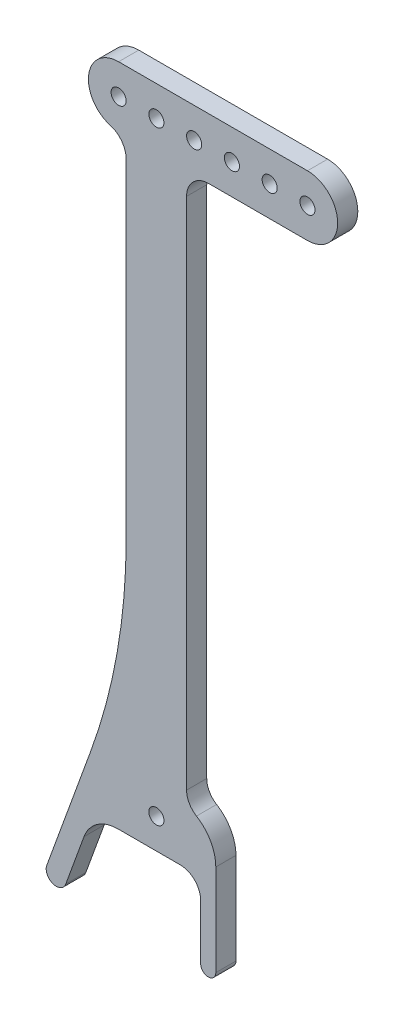
ISO-10303-21;
HEADER;
FILE_DESCRIPTION(('STEP AP214'),'2;1');
FILE_NAME('part.step','',(''),(''),'','','');
FILE_SCHEMA(('AUTOMOTIVE_DESIGN { 1 0 10303 214 1 1 1 1 }'));
ENDSEC;
DATA;
#1=APPLICATION_CONTEXT('core data for automotive mechanical design processes');
#2=APPLICATION_PROTOCOL_DEFINITION('international standard','automotive_design',2000,#1);
#3=PRODUCT_CONTEXT('',#1,'mechanical');
#4=PRODUCT('Part','Part','',(#3));
#5=PRODUCT_RELATED_PRODUCT_CATEGORY('part','',(#4));
#6=PRODUCT_DEFINITION_FORMATION('','',#4);
#7=PRODUCT_DEFINITION_CONTEXT('part definition',#1,'design');
#8=PRODUCT_DEFINITION('design','',#6,#7);
#9=PRODUCT_DEFINITION_SHAPE('','',#8);
#10=(LENGTH_UNIT() NAMED_UNIT(*) SI_UNIT(.MILLI.,.METRE.));
#11=(NAMED_UNIT(*) PLANE_ANGLE_UNIT() SI_UNIT($,.RADIAN.));
#12=(NAMED_UNIT(*) SI_UNIT($,.STERADIAN.) SOLID_ANGLE_UNIT());
#13=UNCERTAINTY_MEASURE_WITH_UNIT(LENGTH_MEASURE(1.E-05),#10,'distance_accuracy_value','');
#14=(GEOMETRIC_REPRESENTATION_CONTEXT(3) GLOBAL_UNCERTAINTY_ASSIGNED_CONTEXT((#13)) GLOBAL_UNIT_ASSIGNED_CONTEXT((#10,
#11,#12)) REPRESENTATION_CONTEXT('',''));
#15=CARTESIAN_POINT('',(0.,0.,0.));
#16=DIRECTION('',(0.,0.,1.));
#17=DIRECTION('',(1.,0.,0.));
#18=AXIS2_PLACEMENT_3D('',#15,#16,#17);
#19=CARTESIAN_POINT('',(26.035,183.515,6.35));
#20=DIRECTION('',(0.,0.,-1.));
#21=DIRECTION('',(-1.,0.,0.));
#22=AXIS2_PLACEMENT_3D('',#19,#20,#21);
#23=PLANE('',#22);
#24=CARTESIAN_POINT('',(26.035,183.515,6.35));
#25=DIRECTION('',(0.,0.,-1.));
#26=DIRECTION('',(-1.,0.,0.));
#27=AXIS2_PLACEMENT_3D('',#24,#25,#26);
#28=CIRCLE('',#27,6.985);
#29=CARTESIAN_POINT('',(19.05,183.515,6.35));
#30=VERTEX_POINT('',#29);
#31=CARTESIAN_POINT('',(26.035,190.5,6.35));
#32=VERTEX_POINT('',#31);
#33=EDGE_CURVE('E278',#30,#32,#28,.T.);
#34=ORIENTED_EDGE('',*,*,#33,.T.);
#35=DIRECTION('',(1.,0.,0.));
#36=VECTOR('',#35,1.);
#37=CARTESIAN_POINT('',(26.035,190.5,6.35));
#38=LINE('',#37,#36);
#39=CARTESIAN_POINT('',(57.15,190.5,6.35));
#40=VERTEX_POINT('',#39);
#41=EDGE_CURVE('E142',#32,#40,#38,.T.);
#42=ORIENTED_EDGE('',*,*,#41,.T.);
#43=CARTESIAN_POINT('',(57.15,200.025,6.35));
#44=DIRECTION('',(0.,0.,1.));
#45=DIRECTION('',(-1.,0.,0.));
#46=AXIS2_PLACEMENT_3D('',#43,#44,#45);
#47=CIRCLE('',#46,9.52500000000001);
#48=CARTESIAN_POINT('',(57.15,209.55,6.35));
#49=VERTEX_POINT('',#48);
#50=EDGE_CURVE('E347',#40,#49,#47,.T.);
#51=ORIENTED_EDGE('',*,*,#50,.T.);
#52=DIRECTION('',(-1.,0.,0.));
#53=VECTOR('',#52,1.);
#54=CARTESIAN_POINT('',(-2.38125000000002,209.55,6.35));
#55=LINE('',#54,#53);
#56=CARTESIAN_POINT('',(-2.38125000000002,209.55,6.35));
#57=VERTEX_POINT('',#56);
#58=EDGE_CURVE('E367',#49,#57,#55,.T.);
#59=ORIENTED_EDGE('',*,*,#58,.T.);
#60=CARTESIAN_POINT('',(-2.38125000000002,200.025,6.35));
#61=DIRECTION('',(0.,0.,1.));
#62=DIRECTION('',(-1.,0.,0.));
#63=AXIS2_PLACEMENT_3D('',#60,#61,#62);
#64=CIRCLE('',#63,9.52500000000002);
#65=CARTESIAN_POINT('',(-5.03725961538463,190.87780163531,6.35));
#66=VERTEX_POINT('',#65);
#67=EDGE_CURVE('E363',#57,#66,#64,.T.);
#68=ORIENTED_EDGE('',*,*,#67,.T.);
#69=CARTESIAN_POINT('',(-6.985,184.169856167871,6.35));
#70=DIRECTION('',(0.,0.,-1.));
#71=DIRECTION('',(-1.,0.,0.));
#72=AXIS2_PLACEMENT_3D('',#69,#70,#71);
#73=CIRCLE('',#72,6.985);
#74=CARTESIAN_POINT('',(0.,184.169856167871,6.35));
#75=VERTEX_POINT('',#74);
#76=EDGE_CURVE('E366',#66,#75,#73,.T.);
#77=ORIENTED_EDGE('',*,*,#76,.T.);
#78=DIRECTION('',(0.,-1.,0.));
#79=VECTOR('',#78,1.);
#80=CARTESIAN_POINT('',(0.,80.3743268631585,6.35));
#81=LINE('',#80,#79);
#82=CARTESIAN_POINT('',(0.,80.3743268631585,6.35));
#83=VERTEX_POINT('',#82);
#84=EDGE_CURVE('E371',#75,#83,#81,.T.);
#85=ORIENTED_EDGE('',*,*,#84,.T.);
#86=CARTESIAN_POINT('',(-185.809678397749,80.3743268631585,6.35));
#87=DIRECTION('',(0.,0.,-1.));
#88=DIRECTION('',(-1.,0.,0.));
#89=AXIS2_PLACEMENT_3D('',#86,#87,#88);
#90=CIRCLE('',#89,185.809678397749);
#91=CARTESIAN_POINT('',(-11.2056947367817,16.8236740262633,6.35));
#92=VERTEX_POINT('',#91);
#93=EDGE_CURVE('E378',#83,#92,#90,.T.);
#94=ORIENTED_EDGE('',*,*,#93,.T.);
#95=DIRECTION('',(-0.342020143325672,-0.939692620785907,0.));
#96=VECTOR('',#95,1.);
#97=CARTESIAN_POINT('',(-11.2056947367817,16.8236740262633,6.35));
#98=LINE('',#97,#96);
#99=CARTESIAN_POINT('',(-25.0230094132897,-21.139086044941,6.35));
#100=VERTEX_POINT('',#99);
#101=EDGE_CURVE('E381',#92,#100,#98,.T.);
#102=ORIENTED_EDGE('',*,*,#101,.T.);
#103=CARTESIAN_POINT('',(-22.0394853422945,-22.225,6.35));
#104=DIRECTION('',(0.,0.,1.));
#105=DIRECTION('',(-1.,0.,0.));
#106=AXIS2_PLACEMENT_3D('',#103,#104,#105);
#107=CIRCLE('',#106,3.175);
#108=CARTESIAN_POINT('',(-19.0559612712992,-23.310913955059,6.35));
#109=VERTEX_POINT('',#108);
#110=EDGE_CURVE('E384',#100,#109,#107,.T.);
#111=ORIENTED_EDGE('',*,*,#110,.T.);
#112=DIRECTION('',(0.342020143325672,0.939692620785907,0.));
#113=VECTOR('',#112,1.);
#114=CARTESIAN_POINT('',(-13.2847044911213,-7.45451626964595,6.35));
#115=LINE('',#114,#113);
#116=CARTESIAN_POINT('',(-13.2847044911213,-7.45451626964595,6.35));
#117=VERTEX_POINT('',#116);
#118=EDGE_CURVE('E387',#109,#117,#115,.T.);
#119=ORIENTED_EDGE('',*,*,#118,.T.);
#120=CARTESIAN_POINT('',(-2.6385519393997,-11.3293989079298,6.35));
#121=DIRECTION('',(0.,0.,-1.));
#122=DIRECTION('',(1.,0.,0.));
#123=AXIS2_PLACEMENT_3D('',#120,#121,#122);
#124=CIRCLE('',#123,11.3293989079298);
#125=CARTESIAN_POINT('',(-2.6385519393997,0.,6.35));
#126=VERTEX_POINT('',#125);
#127=EDGE_CURVE('E390',#117,#126,#124,.T.);
#128=ORIENTED_EDGE('',*,*,#127,.T.);
#129=DIRECTION('',(1.,0.,0.));
#130=VECTOR('',#129,1.);
#131=CARTESIAN_POINT('',(-2.6385519393997,0.,6.35));
#132=LINE('',#131,#130);
#133=CARTESIAN_POINT('',(17.018,0.,6.35));
#134=VERTEX_POINT('',#133);
#135=EDGE_CURVE('E393',#126,#134,#132,.T.);
#136=ORIENTED_EDGE('',*,*,#135,.T.);
#137=CARTESIAN_POINT('',(17.018,-6.477,6.35));
#138=DIRECTION('',(0.,0.,-1.));
#139=DIRECTION('',(-1.,0.,0.));
#140=AXIS2_PLACEMENT_3D('',#137,#138,#139);
#141=CIRCLE('',#140,6.477);
#142=CARTESIAN_POINT('',(23.495,-6.477,6.35));
#143=VERTEX_POINT('',#142);
#144=EDGE_CURVE('E396',#134,#143,#141,.T.);
#145=ORIENTED_EDGE('',*,*,#144,.T.);
#146=DIRECTION('',(0.,-1.,0.));
#147=VECTOR('',#146,1.);
#148=CARTESIAN_POINT('',(23.495,-23.8125,6.35));
#149=LINE('',#148,#147);
#150=CARTESIAN_POINT('',(23.495,-23.8125,6.35));
#151=VERTEX_POINT('',#150);
#152=EDGE_CURVE('E399',#143,#151,#149,.T.);
#153=ORIENTED_EDGE('',*,*,#152,.T.);
#154=CARTESIAN_POINT('',(25.87625,-23.8125,6.35));
#155=DIRECTION('',(0.,0.,1.));
#156=DIRECTION('',(1.,0.,0.));
#157=AXIS2_PLACEMENT_3D('',#154,#155,#156);
#158=CIRCLE('',#157,2.38125);
#159=CARTESIAN_POINT('',(28.2575,-23.8125,6.35));
#160=VERTEX_POINT('',#159);
#161=EDGE_CURVE('E402',#151,#160,#158,.T.);
#162=ORIENTED_EDGE('',*,*,#161,.T.);
#163=DIRECTION('',(0.,1.,0.));
#164=VECTOR('',#163,1.);
#165=CARTESIAN_POINT('',(28.2575,-23.8125,6.35));
#166=LINE('',#165,#164);
#167=CARTESIAN_POINT('',(28.2575,5.02606463283432,6.35));
#168=VERTEX_POINT('',#167);
#169=EDGE_CURVE('E197',#160,#168,#166,.T.);
#170=ORIENTED_EDGE('',*,*,#169,.T.);
#171=CARTESIAN_POINT('',(15.5575,5.02606463283432,6.35));
#172=DIRECTION('',(0.,0.,1.));
#173=DIRECTION('',(-1.,0.,0.));
#174=AXIS2_PLACEMENT_3D('',#171,#172,#173);
#175=CIRCLE('',#174,12.7);
#176=CARTESIAN_POINT('',(22.1598178807947,15.875,6.35));
#177=VERTEX_POINT('',#176);
#178=EDGE_CURVE('E191',#168,#177,#175,.T.);
#179=ORIENTED_EDGE('',*,*,#178,.T.);
#180=CARTESIAN_POINT('',(25.527,21.4079570372545,6.35));
#181=DIRECTION('',(0.,0.,-1.));
#182=DIRECTION('',(1.,0.,0.));
#183=AXIS2_PLACEMENT_3D('',#180,#181,#182);
#184=CIRCLE('',#183,6.477);
#185=CARTESIAN_POINT('',(19.05,21.4079570372545,6.35));
#186=VERTEX_POINT('',#185);
#187=EDGE_CURVE('E195',#177,#186,#184,.T.);
#188=ORIENTED_EDGE('',*,*,#187,.T.);
#189=DIRECTION('',(0.,1.,0.));
#190=VECTOR('',#189,1.);
#191=CARTESIAN_POINT('',(19.05,21.4079570372545,6.35));
#192=LINE('',#191,#190);
#193=EDGE_CURVE('E63',#186,#30,#192,.T.);
#194=ORIENTED_EDGE('',*,*,#193,.T.);
#195=EDGE_LOOP('',(#34,#42,#51,#59,#68,#77,#85,#94,#102,#111,#119,#128,#136,#145,#153,#162,#170,
#179,#188,#194));
#196=FACE_BOUND('',#195,.T.);
#197=CARTESIAN_POINT('',(9.52500000000001,9.525,6.35));
#198=DIRECTION('',(0.,0.,1.));
#199=DIRECTION('',(1.,0.,0.));
#200=AXIS2_PLACEMENT_3D('',#197,#198,#199);
#201=CIRCLE('',#200,2.38125);
#202=CARTESIAN_POINT('',(11.90625,9.525,6.35));
#203=VERTEX_POINT('',#202);
#204=EDGE_CURVE('E224',#203,#203,#201,.T.);
#205=ORIENTED_EDGE('',*,*,#204,.F.);
#206=EDGE_LOOP('',(#205));
#207=FACE_BOUND('',#206,.T.);
#208=CARTESIAN_POINT('',(45.24375,200.025,6.35));
#209=DIRECTION('',(0.,0.,1.));
#210=DIRECTION('',(1.,0.,0.));
#211=AXIS2_PLACEMENT_3D('',#208,#209,#210);
#212=CIRCLE('',#211,2.38125);
#213=CARTESIAN_POINT('',(47.625,200.025,6.35));
#214=VERTEX_POINT('',#213);
#215=EDGE_CURVE('E508',#214,#214,#212,.T.);
#216=ORIENTED_EDGE('',*,*,#215,.F.);
#217=EDGE_LOOP('',(#216));
#218=FACE_BOUND('',#217,.T.);
#219=CARTESIAN_POINT('',(9.52500000000004,200.025,6.35));
#220=DIRECTION('',(0.,0.,1.));
#221=DIRECTION('',(1.,0.,0.));
#222=AXIS2_PLACEMENT_3D('',#219,#220,#221);
#223=CIRCLE('',#222,2.38125);
#224=CARTESIAN_POINT('',(11.90625,200.025,6.35));
#225=VERTEX_POINT('',#224);
#226=EDGE_CURVE('E500',#225,#225,#223,.T.);
#227=ORIENTED_EDGE('',*,*,#226,.F.);
#228=EDGE_LOOP('',(#227));
#229=FACE_BOUND('',#228,.T.);
#230=CARTESIAN_POINT('',(21.43125,200.025,6.35));
#231=DIRECTION('',(0.,0.,1.));
#232=DIRECTION('',(1.,0.,0.));
#233=AXIS2_PLACEMENT_3D('',#230,#231,#232);
#234=CIRCLE('',#233,2.38125);
#235=CARTESIAN_POINT('',(23.8125,200.025,6.35));
#236=VERTEX_POINT('',#235);
#237=EDGE_CURVE('E492',#236,#236,#234,.T.);
#238=ORIENTED_EDGE('',*,*,#237,.F.);
#239=EDGE_LOOP('',(#238));
#240=FACE_BOUND('',#239,.T.);
#241=CARTESIAN_POINT('',(-2.38125000000002,200.025,6.35));
#242=DIRECTION('',(0.,0.,1.));
#243=DIRECTION('',(1.,0.,0.));
#244=AXIS2_PLACEMENT_3D('',#241,#242,#243);
#245=CIRCLE('',#244,2.38125);
#246=CARTESIAN_POINT('',(0.,200.025,6.35));
#247=VERTEX_POINT('',#246);
#248=EDGE_CURVE('E484',#247,#247,#245,.T.);
#249=ORIENTED_EDGE('',*,*,#248,.F.);
#250=EDGE_LOOP('',(#249));
#251=FACE_BOUND('',#250,.T.);
#252=CARTESIAN_POINT('',(33.3375,200.025,6.35));
#253=DIRECTION('',(0.,0.,1.));
#254=DIRECTION('',(1.,0.,0.));
#255=AXIS2_PLACEMENT_3D('',#252,#253,#254);
#256=CIRCLE('',#255,2.38125);
#257=CARTESIAN_POINT('',(35.71875,200.025,6.35));
#258=VERTEX_POINT('',#257);
#259=EDGE_CURVE('E476',#258,#258,#256,.T.);
#260=ORIENTED_EDGE('',*,*,#259,.F.);
#261=EDGE_LOOP('',(#260));
#262=FACE_BOUND('',#261,.T.);
#263=CARTESIAN_POINT('',(57.15,200.025,6.35));
#264=DIRECTION('',(0.,0.,1.));
#265=DIRECTION('',(1.,0.,0.));
#266=AXIS2_PLACEMENT_3D('',#263,#264,#265);
#267=CIRCLE('',#266,2.38125);
#268=CARTESIAN_POINT('',(59.53125,200.025,6.35));
#269=VERTEX_POINT('',#268);
#270=EDGE_CURVE('E465',#269,#269,#267,.T.);
#271=ORIENTED_EDGE('',*,*,#270,.F.);
#272=EDGE_LOOP('',(#271));
#273=FACE_BOUND('',#272,.T.);
#274=ADVANCED_FACE('F45',(#196,#207,#218,#229,#240,#251,#262,#273),#23,.F.);
#275=CARTESIAN_POINT('',(26.035,183.515,0.));
#276=DIRECTION('',(0.,0.,-1.));
#277=DIRECTION('',(-1.,0.,0.));
#278=AXIS2_PLACEMENT_3D('',#275,#276,#277);
#279=PLANE('',#278);
#280=CARTESIAN_POINT('',(33.3375,200.025,0.));
#281=DIRECTION('',(0.,0.,1.));
#282=DIRECTION('',(1.,0.,0.));
#283=AXIS2_PLACEMENT_3D('',#280,#281,#282);
#284=CIRCLE('',#283,2.38125);
#285=CARTESIAN_POINT('',(35.71875,200.025,0.));
#286=VERTEX_POINT('',#285);
#287=EDGE_CURVE('E473',#286,#286,#284,.T.);
#288=ORIENTED_EDGE('',*,*,#287,.T.);
#289=EDGE_LOOP('',(#288));
#290=FACE_BOUND('',#289,.T.);
#291=CARTESIAN_POINT('',(21.43125,200.025,0.));
#292=DIRECTION('',(0.,0.,1.));
#293=DIRECTION('',(1.,0.,0.));
#294=AXIS2_PLACEMENT_3D('',#291,#292,#293);
#295=CIRCLE('',#294,2.38125);
#296=CARTESIAN_POINT('',(23.8125,200.025,0.));
#297=VERTEX_POINT('',#296);
#298=EDGE_CURVE('E488',#297,#297,#295,.T.);
#299=ORIENTED_EDGE('',*,*,#298,.T.);
#300=EDGE_LOOP('',(#299));
#301=FACE_BOUND('',#300,.T.);
#302=CARTESIAN_POINT('',(45.24375,200.025,0.));
#303=DIRECTION('',(0.,0.,1.));
#304=DIRECTION('',(1.,0.,0.));
#305=AXIS2_PLACEMENT_3D('',#302,#303,#304);
#306=CIRCLE('',#305,2.38125);
#307=CARTESIAN_POINT('',(47.625,200.025,0.));
#308=VERTEX_POINT('',#307);
#309=EDGE_CURVE('E504',#308,#308,#306,.T.);
#310=ORIENTED_EDGE('',*,*,#309,.T.);
#311=EDGE_LOOP('',(#310));
#312=FACE_BOUND('',#311,.T.);
#313=CARTESIAN_POINT('',(26.035,183.515,0.));
#314=DIRECTION('',(0.,0.,-1.));
#315=DIRECTION('',(-1.,0.,0.));
#316=AXIS2_PLACEMENT_3D('',#313,#314,#315);
#317=CIRCLE('',#316,6.985);
#318=CARTESIAN_POINT('',(19.05,183.515,0.));
#319=VERTEX_POINT('',#318);
#320=CARTESIAN_POINT('',(26.035,190.5,0.));
#321=VERTEX_POINT('',#320);
#322=EDGE_CURVE('E219',#319,#321,#317,.T.);
#323=ORIENTED_EDGE('',*,*,#322,.F.);
#324=DIRECTION('',(0.,1.,0.));
#325=VECTOR('',#324,1.);
#326=CARTESIAN_POINT('',(19.05,21.4079570372545,0.));
#327=LINE('',#326,#325);
#328=CARTESIAN_POINT('',(19.05,21.4079570372545,0.));
#329=VERTEX_POINT('',#328);
#330=EDGE_CURVE('E134',#329,#319,#327,.T.);
#331=ORIENTED_EDGE('',*,*,#330,.F.);
#332=CARTESIAN_POINT('',(25.527,21.4079570372545,0.));
#333=DIRECTION('',(0.,0.,-1.));
#334=DIRECTION('',(1.,0.,0.));
#335=AXIS2_PLACEMENT_3D('',#332,#333,#334);
#336=CIRCLE('',#335,6.477);
#337=CARTESIAN_POINT('',(22.1598178807947,15.875,0.));
#338=VERTEX_POINT('',#337);
#339=EDGE_CURVE('E128',#338,#329,#336,.T.);
#340=ORIENTED_EDGE('',*,*,#339,.F.);
#341=CARTESIAN_POINT('',(15.5575,5.02606463283432,0.));
#342=DIRECTION('',(0.,0.,1.));
#343=DIRECTION('',(-1.,0.,0.));
#344=AXIS2_PLACEMENT_3D('',#341,#342,#343);
#345=CIRCLE('',#344,12.7);
#346=CARTESIAN_POINT('',(28.2575,5.02606463283432,0.));
#347=VERTEX_POINT('',#346);
#348=EDGE_CURVE('E206',#347,#338,#345,.T.);
#349=ORIENTED_EDGE('',*,*,#348,.F.);
#350=DIRECTION('',(0.,1.,0.));
#351=VECTOR('',#350,1.);
#352=CARTESIAN_POINT('',(28.2575,-23.8125,0.));
#353=LINE('',#352,#351);
#354=CARTESIAN_POINT('',(28.2575,-23.8125,0.));
#355=VERTEX_POINT('',#354);
#356=EDGE_CURVE('E269',#355,#347,#353,.T.);
#357=ORIENTED_EDGE('',*,*,#356,.F.);
#358=CARTESIAN_POINT('',(25.87625,-23.8125,0.));
#359=DIRECTION('',(0.,0.,1.));
#360=DIRECTION('',(1.,0.,0.));
#361=AXIS2_PLACEMENT_3D('',#358,#359,#360);
#362=CIRCLE('',#361,2.38125);
#363=CARTESIAN_POINT('',(23.495,-23.8125,0.));
#364=VERTEX_POINT('',#363);
#365=EDGE_CURVE('E266',#364,#355,#362,.T.);
#366=ORIENTED_EDGE('',*,*,#365,.F.);
#367=DIRECTION('',(0.,-1.,0.));
#368=VECTOR('',#367,1.);
#369=CARTESIAN_POINT('',(23.495,-23.8125,0.));
#370=LINE('',#369,#368);
#371=CARTESIAN_POINT('',(23.495,-6.477,0.));
#372=VERTEX_POINT('',#371);
#373=EDGE_CURVE('E263',#372,#364,#370,.T.);
#374=ORIENTED_EDGE('',*,*,#373,.F.);
#375=CARTESIAN_POINT('',(17.018,-6.477,0.));
#376=DIRECTION('',(0.,0.,-1.));
#377=DIRECTION('',(-1.,0.,0.));
#378=AXIS2_PLACEMENT_3D('',#375,#376,#377);
#379=CIRCLE('',#378,6.477);
#380=CARTESIAN_POINT('',(17.018,0.,0.));
#381=VERTEX_POINT('',#380);
#382=EDGE_CURVE('E260',#381,#372,#379,.T.);
#383=ORIENTED_EDGE('',*,*,#382,.F.);
#384=DIRECTION('',(1.,0.,0.));
#385=VECTOR('',#384,1.);
#386=CARTESIAN_POINT('',(-2.6385519393997,0.,0.));
#387=LINE('',#386,#385);
#388=CARTESIAN_POINT('',(-2.6385519393997,0.,0.));
#389=VERTEX_POINT('',#388);
#390=EDGE_CURVE('E257',#389,#381,#387,.T.);
#391=ORIENTED_EDGE('',*,*,#390,.F.);
#392=CARTESIAN_POINT('',(-2.6385519393997,-11.3293989079298,0.));
#393=DIRECTION('',(0.,0.,-1.));
#394=DIRECTION('',(1.,0.,0.));
#395=AXIS2_PLACEMENT_3D('',#392,#393,#394);
#396=CIRCLE('',#395,11.3293989079298);
#397=CARTESIAN_POINT('',(-13.2847044911213,-7.45451626964595,0.));
#398=VERTEX_POINT('',#397);
#399=EDGE_CURVE('E254',#398,#389,#396,.T.);
#400=ORIENTED_EDGE('',*,*,#399,.F.);
#401=DIRECTION('',(0.342020143325672,0.939692620785907,0.));
#402=VECTOR('',#401,1.);
#403=CARTESIAN_POINT('',(-13.2847044911213,-7.45451626964595,0.));
#404=LINE('',#403,#402);
#405=CARTESIAN_POINT('',(-19.0559612712992,-23.310913955059,0.));
#406=VERTEX_POINT('',#405);
#407=EDGE_CURVE('E251',#406,#398,#404,.T.);
#408=ORIENTED_EDGE('',*,*,#407,.F.);
#409=CARTESIAN_POINT('',(-22.0394853422945,-22.225,0.));
#410=DIRECTION('',(0.,0.,1.));
#411=DIRECTION('',(-1.,0.,0.));
#412=AXIS2_PLACEMENT_3D('',#409,#410,#411);
#413=CIRCLE('',#412,3.175);
#414=CARTESIAN_POINT('',(-25.0230094132897,-21.139086044941,0.));
#415=VERTEX_POINT('',#414);
#416=EDGE_CURVE('E248',#415,#406,#413,.T.);
#417=ORIENTED_EDGE('',*,*,#416,.F.);
#418=DIRECTION('',(-0.342020143325672,-0.939692620785907,0.));
#419=VECTOR('',#418,1.);
#420=CARTESIAN_POINT('',(-11.2056947367817,16.8236740262633,0.));
#421=LINE('',#420,#419);
#422=CARTESIAN_POINT('',(-11.2056947367817,16.8236740262633,0.));
#423=VERTEX_POINT('',#422);
#424=EDGE_CURVE('E245',#423,#415,#421,.T.);
#425=ORIENTED_EDGE('',*,*,#424,.F.);
#426=CARTESIAN_POINT('',(-185.809678397749,80.3743268631585,0.));
#427=DIRECTION('',(0.,0.,-1.));
#428=DIRECTION('',(-1.,0.,0.));
#429=AXIS2_PLACEMENT_3D('',#426,#427,#428);
#430=CIRCLE('',#429,185.809678397749);
#431=CARTESIAN_POINT('',(0.,80.3743268631585,0.));
#432=VERTEX_POINT('',#431);
#433=EDGE_CURVE('E242',#432,#423,#430,.T.);
#434=ORIENTED_EDGE('',*,*,#433,.F.);
#435=DIRECTION('',(0.,-1.,0.));
#436=VECTOR('',#435,1.);
#437=CARTESIAN_POINT('',(0.,80.3743268631585,0.));
#438=LINE('',#437,#436);
#439=CARTESIAN_POINT('',(0.,184.169856167871,0.));
#440=VERTEX_POINT('',#439);
#441=EDGE_CURVE('E239',#440,#432,#438,.T.);
#442=ORIENTED_EDGE('',*,*,#441,.F.);
#443=CARTESIAN_POINT('',(-6.985,184.169856167871,0.));
#444=DIRECTION('',(0.,0.,-1.));
#445=DIRECTION('',(-1.,0.,0.));
#446=AXIS2_PLACEMENT_3D('',#443,#444,#445);
#447=CIRCLE('',#446,6.985);
#448=CARTESIAN_POINT('',(-5.03725961538463,190.87780163531,0.));
#449=VERTEX_POINT('',#448);
#450=EDGE_CURVE('E236',#449,#440,#447,.T.);
#451=ORIENTED_EDGE('',*,*,#450,.F.);
#452=CARTESIAN_POINT('',(-2.38125000000002,200.025,0.));
#453=DIRECTION('',(0.,0.,1.));
#454=DIRECTION('',(-1.,0.,0.));
#455=AXIS2_PLACEMENT_3D('',#452,#453,#454);
#456=CIRCLE('',#455,9.52500000000002);
#457=CARTESIAN_POINT('',(-2.38125000000002,209.55,0.));
#458=VERTEX_POINT('',#457);
#459=EDGE_CURVE('E233',#458,#449,#456,.T.);
#460=ORIENTED_EDGE('',*,*,#459,.F.);
#461=DIRECTION('',(-1.,0.,0.));
#462=VECTOR('',#461,1.);
#463=CARTESIAN_POINT('',(-2.38125000000002,209.55,0.));
#464=LINE('',#463,#462);
#465=CARTESIAN_POINT('',(57.15,209.55,0.));
#466=VERTEX_POINT('',#465);
#467=EDGE_CURVE('E230',#466,#458,#464,.T.);
#468=ORIENTED_EDGE('',*,*,#467,.F.);
#469=CARTESIAN_POINT('',(57.15,200.025,0.));
#470=DIRECTION('',(0.,0.,1.));
#471=DIRECTION('',(-1.,0.,0.));
#472=AXIS2_PLACEMENT_3D('',#469,#470,#471);
#473=CIRCLE('',#472,9.52500000000001);
#474=CARTESIAN_POINT('',(57.15,190.5,0.));
#475=VERTEX_POINT('',#474);
#476=EDGE_CURVE('E227',#475,#466,#473,.T.);
#477=ORIENTED_EDGE('',*,*,#476,.F.);
#478=DIRECTION('',(1.,0.,0.));
#479=VECTOR('',#478,1.);
#480=CARTESIAN_POINT('',(26.035,190.5,0.));
#481=LINE('',#480,#479);
#482=EDGE_CURVE('E223',#321,#475,#481,.T.);
#483=ORIENTED_EDGE('',*,*,#482,.F.);
#484=EDGE_LOOP('',(#323,#331,#340,#349,#357,#366,#374,#383,#391,#400,#408,#417,#425,#434,#442,
#451,#460,#468,#477,#483));
#485=FACE_BOUND('',#484,.T.);
#486=CARTESIAN_POINT('',(9.52500000000001,9.525,0.));
#487=DIRECTION('',(0.,0.,1.));
#488=DIRECTION('',(1.,0.,0.));
#489=AXIS2_PLACEMENT_3D('',#486,#487,#488);
#490=CIRCLE('',#489,2.38125);
#491=CARTESIAN_POINT('',(11.90625,9.525,0.));
#492=VERTEX_POINT('',#491);
#493=EDGE_CURVE('E512',#492,#492,#490,.T.);
#494=ORIENTED_EDGE('',*,*,#493,.T.);
#495=EDGE_LOOP('',(#494));
#496=FACE_BOUND('',#495,.T.);
#497=CARTESIAN_POINT('',(9.52500000000004,200.025,0.));
#498=DIRECTION('',(0.,0.,1.));
#499=DIRECTION('',(1.,0.,0.));
#500=AXIS2_PLACEMENT_3D('',#497,#498,#499);
#501=CIRCLE('',#500,2.38125);
#502=CARTESIAN_POINT('',(11.90625,200.025,0.));
#503=VERTEX_POINT('',#502);
#504=EDGE_CURVE('E496',#503,#503,#501,.T.);
#505=ORIENTED_EDGE('',*,*,#504,.T.);
#506=EDGE_LOOP('',(#505));
#507=FACE_BOUND('',#506,.T.);
#508=CARTESIAN_POINT('',(-2.38125000000002,200.025,0.));
#509=DIRECTION('',(0.,0.,1.));
#510=DIRECTION('',(1.,0.,0.));
#511=AXIS2_PLACEMENT_3D('',#508,#509,#510);
#512=CIRCLE('',#511,2.38125);
#513=CARTESIAN_POINT('',(0.,200.025,0.));
#514=VERTEX_POINT('',#513);
#515=EDGE_CURVE('E480',#514,#514,#512,.T.);
#516=ORIENTED_EDGE('',*,*,#515,.T.);
#517=EDGE_LOOP('',(#516));
#518=FACE_BOUND('',#517,.T.);
#519=CARTESIAN_POINT('',(57.15,200.025,0.));
#520=DIRECTION('',(0.,0.,1.));
#521=DIRECTION('',(1.,0.,0.));
#522=AXIS2_PLACEMENT_3D('',#519,#520,#521);
#523=CIRCLE('',#522,2.38125);
#524=CARTESIAN_POINT('',(59.53125,200.025,0.));
#525=VERTEX_POINT('',#524);
#526=EDGE_CURVE('E468',#525,#525,#523,.T.);
#527=ORIENTED_EDGE('',*,*,#526,.T.);
#528=EDGE_LOOP('',(#527));
#529=FACE_BOUND('',#528,.T.);
#530=ADVANCED_FACE('F351',(#290,#301,#312,#485,#496,#507,#518,#529),#279,.T.);
#531=CARTESIAN_POINT('',(26.035,183.515,6.35));
#532=DIRECTION('',(0.,0.,-1.));
#533=DIRECTION('',(-1.,0.,0.));
#534=AXIS2_PLACEMENT_3D('',#531,#532,#533);
#535=CYLINDRICAL_SURFACE('',#534,6.985);
#536=ORIENTED_EDGE('',*,*,#322,.T.);
#537=DIRECTION('',(0.,0.,-1.));
#538=VECTOR('',#537,1.);
#539=CARTESIAN_POINT('',(26.035,190.5,6.35));
#540=LINE('',#539,#538);
#541=EDGE_CURVE('E11',#32,#321,#540,.T.);
#542=ORIENTED_EDGE('',*,*,#541,.F.);
#543=ORIENTED_EDGE('',*,*,#33,.F.);
#544=DIRECTION('',(0.,0.,-1.));
#545=VECTOR('',#544,1.);
#546=CARTESIAN_POINT('',(19.05,183.515,6.35));
#547=LINE('',#546,#545);
#548=EDGE_CURVE('E215',#30,#319,#547,.T.);
#549=ORIENTED_EDGE('',*,*,#548,.T.);
#550=EDGE_LOOP('',(#536,#542,#543,#549));
#551=FACE_BOUND('',#550,.T.);
#552=ADVANCED_FACE('F47',(#551),#535,.F.);
#553=CARTESIAN_POINT('',(26.035,190.5,6.35));
#554=DIRECTION('',(0.,1.,0.));
#555=DIRECTION('',(-1.,0.,0.));
#556=AXIS2_PLACEMENT_3D('',#553,#554,#555);
#557=PLANE('',#556);
#558=ORIENTED_EDGE('',*,*,#482,.T.);
#559=DIRECTION('',(0.,0.,-1.));
#560=VECTOR('',#559,1.);
#561=CARTESIAN_POINT('',(57.15,190.5,6.35));
#562=LINE('',#561,#560);
#563=EDGE_CURVE('E55',#40,#475,#562,.T.);
#564=ORIENTED_EDGE('',*,*,#563,.F.);
#565=ORIENTED_EDGE('',*,*,#41,.F.);
#566=ORIENTED_EDGE('',*,*,#541,.T.);
#567=EDGE_LOOP('',(#558,#564,#565,#566));
#568=FACE_BOUND('',#567,.T.);
#569=ADVANCED_FACE('F744',(#568),#557,.F.);
#570=CARTESIAN_POINT('',(57.15,200.025,6.35));
#571=DIRECTION('',(0.,0.,-1.));
#572=DIRECTION('',(-1.,0.,0.));
#573=AXIS2_PLACEMENT_3D('',#570,#571,#572);
#574=CYLINDRICAL_SURFACE('',#573,9.52500000000001);
#575=ORIENTED_EDGE('',*,*,#476,.T.);
#576=DIRECTION('',(0.,0.,-1.));
#577=VECTOR('',#576,1.);
#578=CARTESIAN_POINT('',(57.15,209.55,6.35));
#579=LINE('',#578,#577);
#580=EDGE_CURVE('E337',#49,#466,#579,.T.);
#581=ORIENTED_EDGE('',*,*,#580,.F.);
#582=ORIENTED_EDGE('',*,*,#50,.F.);
#583=ORIENTED_EDGE('',*,*,#563,.T.);
#584=EDGE_LOOP('',(#575,#581,#582,#583));
#585=FACE_BOUND('',#584,.T.);
#586=ADVANCED_FACE('F345',(#585),#574,.T.);
#587=CARTESIAN_POINT('',(-2.38125000000002,209.55,6.35));
#588=DIRECTION('',(0.,-1.,0.));
#589=DIRECTION('',(0.,0.,-1.));
#590=AXIS2_PLACEMENT_3D('',#587,#588,#589);
#591=PLANE('',#590);
#592=ORIENTED_EDGE('',*,*,#467,.T.);
#593=DIRECTION('',(0.,0.,-1.));
#594=VECTOR('',#593,1.);
#595=CARTESIAN_POINT('',(-2.38125000000002,209.55,6.35));
#596=LINE('',#595,#594);
#597=EDGE_CURVE('E333',#57,#458,#596,.T.);
#598=ORIENTED_EDGE('',*,*,#597,.F.);
#599=ORIENTED_EDGE('',*,*,#58,.F.);
#600=ORIENTED_EDGE('',*,*,#580,.T.);
#601=EDGE_LOOP('',(#592,#598,#599,#600));
#602=FACE_BOUND('',#601,.T.);
#603=ADVANCED_FACE('F357',(#602),#591,.F.);
#604=CARTESIAN_POINT('',(-2.38125000000002,200.025,6.35));
#605=DIRECTION('',(0.,0.,-1.));
#606=DIRECTION('',(-1.,0.,0.));
#607=AXIS2_PLACEMENT_3D('',#604,#605,#606);
#608=CYLINDRICAL_SURFACE('',#607,9.52500000000002);
#609=ORIENTED_EDGE('',*,*,#459,.T.);
#610=DIRECTION('',(0.,0.,-1.));
#611=VECTOR('',#610,1.);
#612=CARTESIAN_POINT('',(-5.03725961538463,190.87780163531,6.35));
#613=LINE('',#612,#611);
#614=EDGE_CURVE('E329',#66,#449,#613,.T.);
#615=ORIENTED_EDGE('',*,*,#614,.F.);
#616=ORIENTED_EDGE('',*,*,#67,.F.);
#617=ORIENTED_EDGE('',*,*,#597,.T.);
#618=EDGE_LOOP('',(#609,#615,#616,#617));
#619=FACE_BOUND('',#618,.T.);
#620=ADVANCED_FACE('F361',(#619),#608,.T.);
#621=CARTESIAN_POINT('',(-6.985,184.169856167871,6.35));
#622=DIRECTION('',(0.,0.,-1.));
#623=DIRECTION('',(-1.,0.,0.));
#624=AXIS2_PLACEMENT_3D('',#621,#622,#623);
#625=CYLINDRICAL_SURFACE('',#624,6.985);
#626=ORIENTED_EDGE('',*,*,#450,.T.);
#627=DIRECTION('',(0.,0.,-1.));
#628=VECTOR('',#627,1.);
#629=CARTESIAN_POINT('',(0.,184.169856167871,6.35));
#630=LINE('',#629,#628);
#631=EDGE_CURVE('E325',#75,#440,#630,.T.);
#632=ORIENTED_EDGE('',*,*,#631,.F.);
#633=ORIENTED_EDGE('',*,*,#76,.F.);
#634=ORIENTED_EDGE('',*,*,#614,.T.);
#635=EDGE_LOOP('',(#626,#632,#633,#634));
#636=FACE_BOUND('',#635,.T.);
#637=ADVANCED_FACE('F709',(#636),#625,.F.);
#638=CARTESIAN_POINT('',(0.,80.3743268631585,6.35));
#639=DIRECTION('',(1.,0.,0.));
#640=DIRECTION('',(0.,0.,-1.));
#641=AXIS2_PLACEMENT_3D('',#638,#639,#640);
#642=PLANE('',#641);
#643=ORIENTED_EDGE('',*,*,#441,.T.);
#644=DIRECTION('',(0.,0.,-1.));
#645=VECTOR('',#644,1.);
#646=CARTESIAN_POINT('',(0.,80.3743268631585,6.35));
#647=LINE('',#646,#645);
#648=EDGE_CURVE('E321',#83,#432,#647,.T.);
#649=ORIENTED_EDGE('',*,*,#648,.F.);
#650=ORIENTED_EDGE('',*,*,#84,.F.);
#651=ORIENTED_EDGE('',*,*,#631,.T.);
#652=EDGE_LOOP('',(#643,#649,#650,#651));
#653=FACE_BOUND('',#652,.T.);
#654=ADVANCED_FACE('F699',(#653),#642,.F.);
#655=CARTESIAN_POINT('',(-185.809678397749,80.3743268631585,6.35));
#656=DIRECTION('',(0.,0.,-1.));
#657=DIRECTION('',(-1.,0.,0.));
#658=AXIS2_PLACEMENT_3D('',#655,#656,#657);
#659=CYLINDRICAL_SURFACE('',#658,185.809678397749);
#660=ORIENTED_EDGE('',*,*,#433,.T.);
#661=DIRECTION('',(0.,0.,-1.));
#662=VECTOR('',#661,1.);
#663=CARTESIAN_POINT('',(-11.2056947367817,16.8236740262633,6.35));
#664=LINE('',#663,#662);
#665=EDGE_CURVE('E317',#92,#423,#664,.T.);
#666=ORIENTED_EDGE('',*,*,#665,.F.);
#667=ORIENTED_EDGE('',*,*,#93,.F.);
#668=ORIENTED_EDGE('',*,*,#648,.T.);
#669=EDGE_LOOP('',(#660,#666,#667,#668));
#670=FACE_BOUND('',#669,.T.);
#671=ADVANCED_FACE('F689',(#670),#659,.F.);
#672=CARTESIAN_POINT('',(-11.2056947367817,16.8236740262633,6.35));
#673=DIRECTION('',(0.939692620785907,-0.342020143325672,0.));
#674=DIRECTION('',(0.342020143325672,0.939692620785907,0.));
#675=AXIS2_PLACEMENT_3D('',#672,#673,#674);
#676=PLANE('',#675);
#677=ORIENTED_EDGE('',*,*,#424,.T.);
#678=DIRECTION('',(0.,0.,-1.));
#679=VECTOR('',#678,1.);
#680=CARTESIAN_POINT('',(-25.0230094132897,-21.139086044941,6.35));
#681=LINE('',#680,#679);
#682=EDGE_CURVE('E313',#100,#415,#681,.T.);
#683=ORIENTED_EDGE('',*,*,#682,.F.);
#684=ORIENTED_EDGE('',*,*,#101,.F.);
#685=ORIENTED_EDGE('',*,*,#665,.T.);
#686=EDGE_LOOP('',(#677,#683,#684,#685));
#687=FACE_BOUND('',#686,.T.);
#688=ADVANCED_FACE('F679',(#687),#676,.F.);
#689=CARTESIAN_POINT('',(-22.0394853422945,-22.225,6.35));
#690=DIRECTION('',(0.,0.,-1.));
#691=DIRECTION('',(-1.,0.,0.));
#692=AXIS2_PLACEMENT_3D('',#689,#690,#691);
#693=CYLINDRICAL_SURFACE('',#692,3.175);
#694=ORIENTED_EDGE('',*,*,#416,.T.);
#695=DIRECTION('',(0.,0.,-1.));
#696=VECTOR('',#695,1.);
#697=CARTESIAN_POINT('',(-19.0559612712992,-23.310913955059,6.35));
#698=LINE('',#697,#696);
#699=EDGE_CURVE('E309',#109,#406,#698,.T.);
#700=ORIENTED_EDGE('',*,*,#699,.F.);
#701=ORIENTED_EDGE('',*,*,#110,.F.);
#702=ORIENTED_EDGE('',*,*,#682,.T.);
#703=EDGE_LOOP('',(#694,#700,#701,#702));
#704=FACE_BOUND('',#703,.T.);
#705=ADVANCED_FACE('F669',(#704),#693,.T.);
#706=CARTESIAN_POINT('',(-13.2847044911213,-7.45451626964595,6.35));
#707=DIRECTION('',(-0.939692620785907,0.342020143325672,0.));
#708=DIRECTION('',(-0.342020143325673,-0.939692620785907,0.));
#709=AXIS2_PLACEMENT_3D('',#706,#707,#708);
#710=PLANE('',#709);
#711=ORIENTED_EDGE('',*,*,#407,.T.);
#712=DIRECTION('',(0.,0.,-1.));
#713=VECTOR('',#712,1.);
#714=CARTESIAN_POINT('',(-13.2847044911213,-7.45451626964595,6.35));
#715=LINE('',#714,#713);
#716=EDGE_CURVE('E305',#117,#398,#715,.T.);
#717=ORIENTED_EDGE('',*,*,#716,.F.);
#718=ORIENTED_EDGE('',*,*,#118,.F.);
#719=ORIENTED_EDGE('',*,*,#699,.T.);
#720=EDGE_LOOP('',(#711,#717,#718,#719));
#721=FACE_BOUND('',#720,.T.);
#722=ADVANCED_FACE('F659',(#721),#710,.F.);
#723=CARTESIAN_POINT('',(-2.6385519393997,-11.3293989079298,6.35));
#724=DIRECTION('',(0.,0.,-1.));
#725=DIRECTION('',(-1.,0.,0.));
#726=AXIS2_PLACEMENT_3D('',#723,#724,#725);
#727=CYLINDRICAL_SURFACE('',#726,11.3293989079298);
#728=ORIENTED_EDGE('',*,*,#399,.T.);
#729=DIRECTION('',(0.,0.,-1.));
#730=VECTOR('',#729,1.);
#731=CARTESIAN_POINT('',(-2.6385519393997,0.,6.35));
#732=LINE('',#731,#730);
#733=EDGE_CURVE('E301',#126,#389,#732,.T.);
#734=ORIENTED_EDGE('',*,*,#733,.F.);
#735=ORIENTED_EDGE('',*,*,#127,.F.);
#736=ORIENTED_EDGE('',*,*,#716,.T.);
#737=EDGE_LOOP('',(#728,#734,#735,#736));
#738=FACE_BOUND('',#737,.T.);
#739=ADVANCED_FACE('F649',(#738),#727,.F.);
#740=CARTESIAN_POINT('',(-2.6385519393997,0.,6.35));
#741=DIRECTION('',(0.,1.,0.));
#742=DIRECTION('',(0.,0.,1.));
#743=AXIS2_PLACEMENT_3D('',#740,#741,#742);
#744=PLANE('',#743);
#745=ORIENTED_EDGE('',*,*,#390,.T.);
#746=DIRECTION('',(0.,0.,-1.));
#747=VECTOR('',#746,1.);
#748=CARTESIAN_POINT('',(17.018,0.,6.35));
#749=LINE('',#748,#747);
#750=EDGE_CURVE('E297',#134,#381,#749,.T.);
#751=ORIENTED_EDGE('',*,*,#750,.F.);
#752=ORIENTED_EDGE('',*,*,#135,.F.);
#753=ORIENTED_EDGE('',*,*,#733,.T.);
#754=EDGE_LOOP('',(#745,#751,#752,#753));
#755=FACE_BOUND('',#754,.T.);
#756=ADVANCED_FACE('F639',(#755),#744,.F.);
#757=CARTESIAN_POINT('',(17.018,-6.477,6.35));
#758=DIRECTION('',(0.,0.,-1.));
#759=DIRECTION('',(-1.,0.,0.));
#760=AXIS2_PLACEMENT_3D('',#757,#758,#759);
#761=CYLINDRICAL_SURFACE('',#760,6.477);
#762=ORIENTED_EDGE('',*,*,#382,.T.);
#763=DIRECTION('',(0.,0.,-1.));
#764=VECTOR('',#763,1.);
#765=CARTESIAN_POINT('',(23.495,-6.477,6.35));
#766=LINE('',#765,#764);
#767=EDGE_CURVE('E293',#143,#372,#766,.T.);
#768=ORIENTED_EDGE('',*,*,#767,.F.);
#769=ORIENTED_EDGE('',*,*,#144,.F.);
#770=ORIENTED_EDGE('',*,*,#750,.T.);
#771=EDGE_LOOP('',(#762,#768,#769,#770));
#772=FACE_BOUND('',#771,.T.);
#773=ADVANCED_FACE('F629',(#772),#761,.F.);
#774=CARTESIAN_POINT('',(23.495,-23.8125,6.35));
#775=DIRECTION('',(1.,0.,0.));
#776=DIRECTION('',(0.,1.,0.));
#777=AXIS2_PLACEMENT_3D('',#774,#775,#776);
#778=PLANE('',#777);
#779=ORIENTED_EDGE('',*,*,#373,.T.);
#780=DIRECTION('',(0.,0.,-1.));
#781=VECTOR('',#780,1.);
#782=CARTESIAN_POINT('',(23.495,-23.8125,6.35));
#783=LINE('',#782,#781);
#784=EDGE_CURVE('E289',#151,#364,#783,.T.);
#785=ORIENTED_EDGE('',*,*,#784,.F.);
#786=ORIENTED_EDGE('',*,*,#152,.F.);
#787=ORIENTED_EDGE('',*,*,#767,.T.);
#788=EDGE_LOOP('',(#779,#785,#786,#787));
#789=FACE_BOUND('',#788,.T.);
#790=ADVANCED_FACE('F620',(#789),#778,.F.);
#791=CARTESIAN_POINT('',(25.87625,-23.8125,6.35));
#792=DIRECTION('',(0.,0.,-1.));
#793=DIRECTION('',(-1.,0.,0.));
#794=AXIS2_PLACEMENT_3D('',#791,#792,#793);
#795=CYLINDRICAL_SURFACE('',#794,2.38125);
#796=ORIENTED_EDGE('',*,*,#365,.T.);
#797=DIRECTION('',(0.,0.,-1.));
#798=VECTOR('',#797,1.);
#799=CARTESIAN_POINT('',(28.2575,-23.8125,6.35));
#800=LINE('',#799,#798);
#801=EDGE_CURVE('E285',#160,#355,#800,.T.);
#802=ORIENTED_EDGE('',*,*,#801,.F.);
#803=ORIENTED_EDGE('',*,*,#161,.F.);
#804=ORIENTED_EDGE('',*,*,#784,.T.);
#805=EDGE_LOOP('',(#796,#802,#803,#804));
#806=FACE_BOUND('',#805,.T.);
#807=ADVANCED_FACE('F410',(#806),#795,.T.);
#808=CARTESIAN_POINT('',(28.2575,-23.8125,6.35));
#809=DIRECTION('',(-1.,0.,0.));
#810=DIRECTION('',(0.,-1.,0.));
#811=AXIS2_PLACEMENT_3D('',#808,#809,#810);
#812=PLANE('',#811);
#813=ORIENTED_EDGE('',*,*,#356,.T.);
#814=DIRECTION('',(0.,0.,-1.));
#815=VECTOR('',#814,1.);
#816=CARTESIAN_POINT('',(28.2575,5.02606463283432,6.35));
#817=LINE('',#816,#815);
#818=EDGE_CURVE('E208',#168,#347,#817,.T.);
#819=ORIENTED_EDGE('',*,*,#818,.F.);
#820=ORIENTED_EDGE('',*,*,#169,.F.);
#821=ORIENTED_EDGE('',*,*,#801,.T.);
#822=EDGE_LOOP('',(#813,#819,#820,#821));
#823=FACE_BOUND('',#822,.T.);
#824=ADVANCED_FACE('F414',(#823),#812,.F.);
#825=CARTESIAN_POINT('',(15.5575,5.02606463283432,6.35));
#826=DIRECTION('',(0.,0.,-1.));
#827=DIRECTION('',(-1.,0.,0.));
#828=AXIS2_PLACEMENT_3D('',#825,#826,#827);
#829=CYLINDRICAL_SURFACE('',#828,12.7);
#830=ORIENTED_EDGE('',*,*,#348,.T.);
#831=DIRECTION('',(0.,0.,-1.));
#832=VECTOR('',#831,1.);
#833=CARTESIAN_POINT('',(22.1598178807947,15.875,6.35));
#834=LINE('',#833,#832);
#835=EDGE_CURVE('E203',#177,#338,#834,.T.);
#836=ORIENTED_EDGE('',*,*,#835,.F.);
#837=ORIENTED_EDGE('',*,*,#178,.F.);
#838=ORIENTED_EDGE('',*,*,#818,.T.);
#839=EDGE_LOOP('',(#830,#836,#837,#838));
#840=FACE_BOUND('',#839,.T.);
#841=ADVANCED_FACE('F204',(#840),#829,.T.);
#842=CARTESIAN_POINT('',(25.527,21.4079570372545,6.35));
#843=DIRECTION('',(0.,0.,-1.));
#844=DIRECTION('',(-1.,0.,0.));
#845=AXIS2_PLACEMENT_3D('',#842,#843,#844);
#846=CYLINDRICAL_SURFACE('',#845,6.477);
#847=ORIENTED_EDGE('',*,*,#339,.T.);
#848=DIRECTION('',(0.,0.,-1.));
#849=VECTOR('',#848,1.);
#850=CARTESIAN_POINT('',(19.05,21.4079570372545,6.35));
#851=LINE('',#850,#849);
#852=EDGE_CURVE('E209',#186,#329,#851,.T.);
#853=ORIENTED_EDGE('',*,*,#852,.F.);
#854=ORIENTED_EDGE('',*,*,#187,.F.);
#855=ORIENTED_EDGE('',*,*,#835,.T.);
#856=EDGE_LOOP('',(#847,#853,#854,#855));
#857=FACE_BOUND('',#856,.T.);
#858=ADVANCED_FACE('F211',(#857),#846,.F.);
#859=CARTESIAN_POINT('',(19.05,21.4079570372545,6.35));
#860=DIRECTION('',(-1.,0.,0.));
#861=DIRECTION('',(0.,0.,1.));
#862=AXIS2_PLACEMENT_3D('',#859,#860,#861);
#863=PLANE('',#862);
#864=ORIENTED_EDGE('',*,*,#330,.T.);
#865=ORIENTED_EDGE('',*,*,#548,.F.);
#866=ORIENTED_EDGE('',*,*,#193,.F.);
#867=ORIENTED_EDGE('',*,*,#852,.T.);
#868=EDGE_LOOP('',(#864,#865,#866,#867));
#869=FACE_BOUND('',#868,.T.);
#870=ADVANCED_FACE('F418',(#869),#863,.F.);
#871=CARTESIAN_POINT('',(9.52500000000001,9.525,6.35));
#872=DIRECTION('',(0.,0.,-1.));
#873=DIRECTION('',(-1.,0.,0.));
#874=AXIS2_PLACEMENT_3D('',#871,#872,#873);
#875=CYLINDRICAL_SURFACE('',#874,2.38125);
#876=ORIENTED_EDGE('',*,*,#204,.T.);
#877=EDGE_LOOP('',(#876));
#878=FACE_BOUND('',#877,.T.);
#879=ORIENTED_EDGE('',*,*,#493,.F.);
#880=EDGE_LOOP('',(#879));
#881=FACE_BOUND('',#880,.T.);
#882=ADVANCED_FACE('F420',(#878,#881),#875,.F.);
#883=CARTESIAN_POINT('',(45.24375,200.025,6.35));
#884=DIRECTION('',(0.,0.,-1.));
#885=DIRECTION('',(-1.,0.,0.));
#886=AXIS2_PLACEMENT_3D('',#883,#884,#885);
#887=CYLINDRICAL_SURFACE('',#886,2.38125);
#888=ORIENTED_EDGE('',*,*,#215,.T.);
#889=EDGE_LOOP('',(#888));
#890=FACE_BOUND('',#889,.T.);
#891=ORIENTED_EDGE('',*,*,#309,.F.);
#892=EDGE_LOOP('',(#891));
#893=FACE_BOUND('',#892,.T.);
#894=ADVANCED_FACE('F426',(#890,#893),#887,.F.);
#895=CARTESIAN_POINT('',(9.52500000000004,200.025,6.35));
#896=DIRECTION('',(0.,0.,-1.));
#897=DIRECTION('',(-1.,0.,0.));
#898=AXIS2_PLACEMENT_3D('',#895,#896,#897);
#899=CYLINDRICAL_SURFACE('',#898,2.38125);
#900=ORIENTED_EDGE('',*,*,#226,.T.);
#901=EDGE_LOOP('',(#900));
#902=FACE_BOUND('',#901,.T.);
#903=ORIENTED_EDGE('',*,*,#504,.F.);
#904=EDGE_LOOP('',(#903));
#905=FACE_BOUND('',#904,.T.);
#906=ADVANCED_FACE('F440',(#902,#905),#899,.F.);
#907=CARTESIAN_POINT('',(21.43125,200.025,6.35));
#908=DIRECTION('',(0.,0.,-1.));
#909=DIRECTION('',(-1.,0.,0.));
#910=AXIS2_PLACEMENT_3D('',#907,#908,#909);
#911=CYLINDRICAL_SURFACE('',#910,2.38125);
#912=ORIENTED_EDGE('',*,*,#237,.T.);
#913=EDGE_LOOP('',(#912));
#914=FACE_BOUND('',#913,.T.);
#915=ORIENTED_EDGE('',*,*,#298,.F.);
#916=EDGE_LOOP('',(#915));
#917=FACE_BOUND('',#916,.T.);
#918=ADVANCED_FACE('F444',(#914,#917),#911,.F.);
#919=CARTESIAN_POINT('',(-2.38125000000002,200.025,6.35));
#920=DIRECTION('',(0.,0.,-1.));
#921=DIRECTION('',(-1.,0.,0.));
#922=AXIS2_PLACEMENT_3D('',#919,#920,#921);
#923=CYLINDRICAL_SURFACE('',#922,2.38125);
#924=ORIENTED_EDGE('',*,*,#248,.T.);
#925=EDGE_LOOP('',(#924));
#926=FACE_BOUND('',#925,.T.);
#927=ORIENTED_EDGE('',*,*,#515,.F.);
#928=EDGE_LOOP('',(#927));
#929=FACE_BOUND('',#928,.T.);
#930=ADVANCED_FACE('F448',(#926,#929),#923,.F.);
#931=CARTESIAN_POINT('',(33.3375,200.025,6.35));
#932=DIRECTION('',(0.,0.,-1.));
#933=DIRECTION('',(-1.,0.,0.));
#934=AXIS2_PLACEMENT_3D('',#931,#932,#933);
#935=CYLINDRICAL_SURFACE('',#934,2.38125);
#936=ORIENTED_EDGE('',*,*,#259,.T.);
#937=EDGE_LOOP('',(#936));
#938=FACE_BOUND('',#937,.T.);
#939=ORIENTED_EDGE('',*,*,#287,.F.);
#940=EDGE_LOOP('',(#939));
#941=FACE_BOUND('',#940,.T.);
#942=ADVANCED_FACE('F452',(#938,#941),#935,.F.);
#943=CARTESIAN_POINT('',(57.15,200.025,6.35));
#944=DIRECTION('',(0.,0.,-1.));
#945=DIRECTION('',(-1.,0.,0.));
#946=AXIS2_PLACEMENT_3D('',#943,#944,#945);
#947=CYLINDRICAL_SURFACE('',#946,2.38125);
#948=ORIENTED_EDGE('',*,*,#270,.T.);
#949=EDGE_LOOP('',(#948));
#950=FACE_BOUND('',#949,.T.);
#951=ORIENTED_EDGE('',*,*,#526,.F.);
#952=EDGE_LOOP('',(#951));
#953=FACE_BOUND('',#952,.T.);
#954=ADVANCED_FACE('F456',(#950,#953),#947,.F.);
#955=CLOSED_SHELL('',(#274,#530,#552,#569,#586,#603,#620,#637,#654,#671,#688,#705,#722,#739,
#756,#773,#790,#807,#824,#841,#858,#870,#882,#894,#906,#918,#930,#942,#954));
#956=MANIFOLD_SOLID_BREP('B2',#955);
#957=ADVANCED_BREP_SHAPE_REPRESENTATION('',(#18,#956),#14);
#958=SHAPE_DEFINITION_REPRESENTATION(#9,#957);
ENDSEC;
END-ISO-10303-21;
